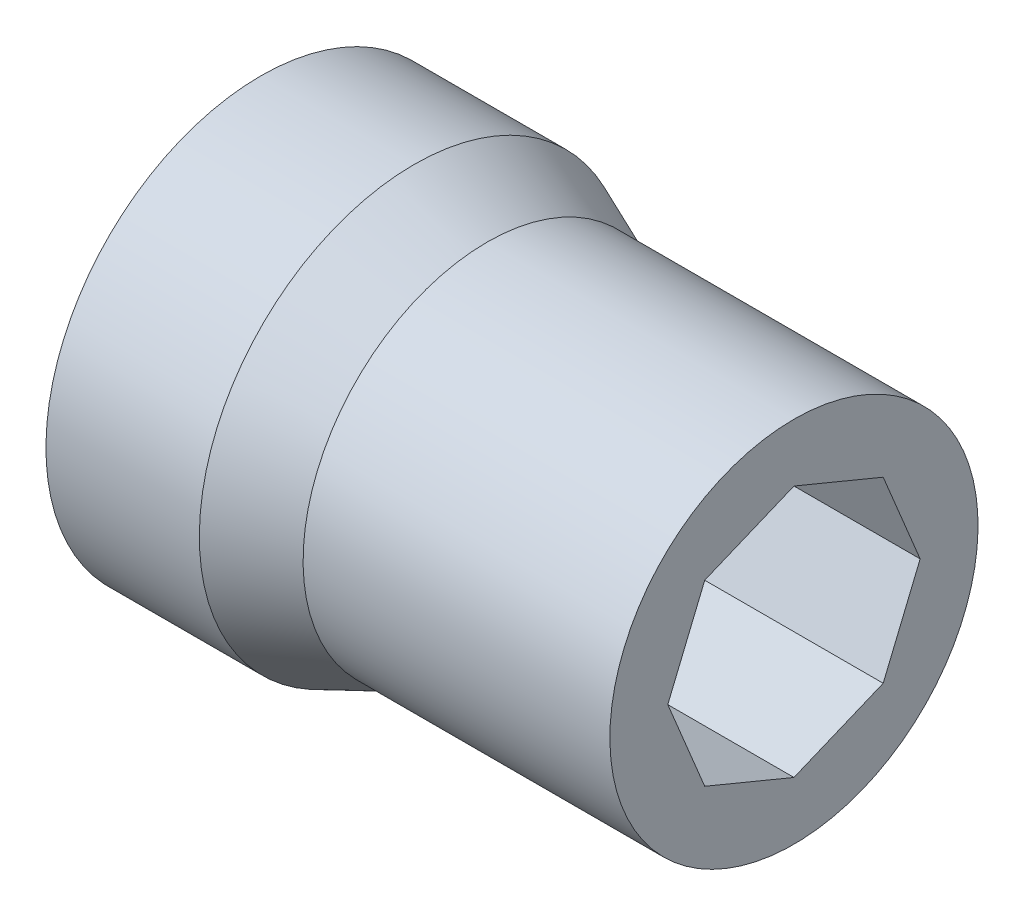
ISO-10303-21;
HEADER;
FILE_DESCRIPTION(('STEP AP214'),'2;1');
FILE_NAME('part.step','',(''),(''),'','','');
FILE_SCHEMA(('AUTOMOTIVE_DESIGN { 1 0 10303 214 1 1 1 1 }'));
ENDSEC;
DATA;
#1=APPLICATION_CONTEXT('core data for automotive mechanical design processes');
#2=APPLICATION_PROTOCOL_DEFINITION('international standard','automotive_design',2000,#1);
#3=PRODUCT_CONTEXT('',#1,'mechanical');
#4=PRODUCT('Part','Part','',(#3));
#5=PRODUCT_RELATED_PRODUCT_CATEGORY('part','',(#4));
#6=PRODUCT_DEFINITION_FORMATION('','',#4);
#7=PRODUCT_DEFINITION_CONTEXT('part definition',#1,'design');
#8=PRODUCT_DEFINITION('design','',#6,#7);
#9=PRODUCT_DEFINITION_SHAPE('','',#8);
#10=(LENGTH_UNIT() NAMED_UNIT(*) SI_UNIT(.MILLI.,.METRE.));
#11=(NAMED_UNIT(*) PLANE_ANGLE_UNIT() SI_UNIT($,.RADIAN.));
#12=(NAMED_UNIT(*) SI_UNIT($,.STERADIAN.) SOLID_ANGLE_UNIT());
#13=UNCERTAINTY_MEASURE_WITH_UNIT(LENGTH_MEASURE(1.E-05),#10,'distance_accuracy_value','');
#14=(GEOMETRIC_REPRESENTATION_CONTEXT(3) GLOBAL_UNCERTAINTY_ASSIGNED_CONTEXT((#13)) GLOBAL_UNIT_ASSIGNED_CONTEXT((#10,
#11,#12)) REPRESENTATION_CONTEXT('',''));
#15=CARTESIAN_POINT('',(0.,0.,0.));
#16=DIRECTION('',(0.,0.,1.));
#17=DIRECTION('',(1.,0.,0.));
#18=AXIS2_PLACEMENT_3D('',#15,#16,#17);
#19=CARTESIAN_POINT('',(3.6905989232415,0.,0.));
#20=DIRECTION('',(-1.,0.,0.));
#21=DIRECTION('',(0.,-1.,0.));
#22=AXIS2_PLACEMENT_3D('',#19,#20,#21);
#23=PLANE('',#22);
#24=DIRECTION('',(0.,-0.923879532511285,-0.382683432365095));
#25=VECTOR('',#24,1.);
#26=CARTESIAN_POINT('',(3.6905989232415,0.,2.05654518055555));
#27=LINE('',#26,#25);
#28=CARTESIAN_POINT('',(3.6905989232415,0.,2.05654518055555));
#29=VERTEX_POINT('',#28);
#30=CARTESIAN_POINT('',(3.6905989232415,-1.45419704298735,1.45419704298733));
#31=VERTEX_POINT('',#30);
#32=EDGE_CURVE('E152',#29,#31,#27,.T.);
#33=ORIENTED_EDGE('',*,*,#32,.F.);
#34=DIRECTION('',(0.,-0.923879532511289,0.382683432365085));
#35=VECTOR('',#34,1.);
#36=CARTESIAN_POINT('',(3.6905989232415,1.45419704298733,1.45419704298735));
#37=LINE('',#36,#35);
#38=CARTESIAN_POINT('',(3.6905989232415,1.45419704298733,1.45419704298735));
#39=VERTEX_POINT('',#38);
#40=EDGE_CURVE('E60',#39,#29,#37,.T.);
#41=ORIENTED_EDGE('',*,*,#40,.F.);
#42=DIRECTION('',(0.,-0.382683432365095,0.923879532511285));
#43=VECTOR('',#42,1.);
#44=CARTESIAN_POINT('',(3.6905989232415,2.05654518055555,0.));
#45=LINE('',#44,#43);
#46=CARTESIAN_POINT('',(3.6905989232415,2.05654518055555,0.));
#47=VERTEX_POINT('',#46);
#48=EDGE_CURVE('E173',#47,#39,#45,.T.);
#49=ORIENTED_EDGE('',*,*,#48,.F.);
#50=DIRECTION('',(0.,0.382683432365085,0.923879532511289));
#51=VECTOR('',#50,1.);
#52=CARTESIAN_POINT('',(3.6905989232415,1.45419704298735,-1.45419704298733));
#53=LINE('',#52,#51);
#54=CARTESIAN_POINT('',(3.6905989232415,1.45419704298735,-1.45419704298733));
#55=VERTEX_POINT('',#54);
#56=EDGE_CURVE('E170',#55,#47,#53,.T.);
#57=ORIENTED_EDGE('',*,*,#56,.F.);
#58=DIRECTION('',(0.,0.923879532511285,0.382683432365095));
#59=VECTOR('',#58,1.);
#60=CARTESIAN_POINT('',(3.6905989232415,0.,-2.05654518055555));
#61=LINE('',#60,#59);
#62=CARTESIAN_POINT('',(3.6905989232415,0.,-2.05654518055555));
#63=VERTEX_POINT('',#62);
#64=EDGE_CURVE('E120',#63,#55,#61,.T.);
#65=ORIENTED_EDGE('',*,*,#64,.F.);
#66=DIRECTION('',(0.,0.923879532511289,-0.382683432365085));
#67=VECTOR('',#66,1.);
#68=CARTESIAN_POINT('',(3.6905989232415,-1.45419704298733,-1.45419704298735));
#69=LINE('',#68,#67);
#70=CARTESIAN_POINT('',(3.6905989232415,-1.45419704298733,-1.45419704298735));
#71=VERTEX_POINT('',#70);
#72=EDGE_CURVE('E164',#71,#63,#69,.T.);
#73=ORIENTED_EDGE('',*,*,#72,.F.);
#74=DIRECTION('',(0.,0.382683432365095,-0.923879532511285));
#75=VECTOR('',#74,1.);
#76=CARTESIAN_POINT('',(3.6905989232415,-2.05654518055555,0.));
#77=LINE('',#76,#75);
#78=CARTESIAN_POINT('',(3.6905989232415,-2.05654518055555,0.));
#79=VERTEX_POINT('',#78);
#80=EDGE_CURVE('E160',#79,#71,#77,.T.);
#81=ORIENTED_EDGE('',*,*,#80,.F.);
#82=DIRECTION('',(0.,-0.382683432365085,-0.923879532511289));
#83=VECTOR('',#82,1.);
#84=CARTESIAN_POINT('',(3.6905989232415,-1.45419704298735,1.45419704298733));
#85=LINE('',#84,#83);
#86=EDGE_CURVE('E156',#31,#79,#85,.T.);
#87=ORIENTED_EDGE('',*,*,#86,.F.);
#88=EDGE_LOOP('',(#33,#41,#49,#57,#65,#73,#81,#87));
#89=FACE_BOUND('',#88,.T.);
#90=CARTESIAN_POINT('',(3.6905989232415,0.,0.));
#91=DIRECTION('',(1.,0.,0.));
#92=DIRECTION('',(0.,1.,0.));
#93=AXIS2_PLACEMENT_3D('',#90,#91,#92);
#94=CIRCLE('',#93,3.);
#95=CARTESIAN_POINT('',(3.6905989232415,3.,0.));
#96=VERTEX_POINT('',#95);
#97=EDGE_CURVE('E11',#96,#96,#94,.T.);
#98=ORIENTED_EDGE('',*,*,#97,.T.);
#99=EDGE_LOOP('',(#98));
#100=FACE_BOUND('',#99,.T.);
#101=ADVANCED_FACE('F45',(#89,#100),#23,.F.);
#102=CARTESIAN_POINT('',(0.,0.,0.));
#103=DIRECTION('',(1.,0.,0.));
#104=DIRECTION('',(0.,1.,0.));
#105=AXIS2_PLACEMENT_3D('',#102,#103,#104);
#106=CYLINDRICAL_SURFACE('',#105,3.);
#107=ORIENTED_EDGE('',*,*,#97,.F.);
#108=EDGE_LOOP('',(#107));
#109=FACE_BOUND('',#108,.T.);
#110=CARTESIAN_POINT('',(-1.3094010767585,0.,0.));
#111=DIRECTION('',(1.,0.,0.));
#112=DIRECTION('',(0.,1.,0.));
#113=AXIS2_PLACEMENT_3D('',#110,#111,#112);
#114=CIRCLE('',#113,3.);
#115=CARTESIAN_POINT('',(-1.3094010767585,3.,0.));
#116=VERTEX_POINT('',#115);
#117=EDGE_CURVE('E53',#116,#116,#114,.T.);
#118=ORIENTED_EDGE('',*,*,#117,.T.);
#119=EDGE_LOOP('',(#118));
#120=FACE_BOUND('',#119,.T.);
#121=ADVANCED_FACE('F205',(#109,#120),#106,.T.);
#122=CARTESIAN_POINT('',(-1.3094010767585,0.,0.));
#123=DIRECTION('',(-1.,0.,0.));
#124=DIRECTION('',(0.,-1.,0.));
#125=AXIS2_PLACEMENT_3D('',#122,#123,#124);
#126=CONICAL_SURFACE('',#125,3.,0.397591187437425);
#127=CARTESIAN_POINT('',(-2.5,0.,0.));
#128=DIRECTION('',(1.,0.,0.));
#129=DIRECTION('',(0.,1.,0.));
#130=AXIS2_PLACEMENT_3D('',#127,#128,#129);
#131=CIRCLE('',#130,3.5);
#132=CARTESIAN_POINT('',(-2.5,3.5,0.));
#133=VERTEX_POINT('',#132);
#134=EDGE_CURVE('E198',#133,#133,#131,.T.);
#135=ORIENTED_EDGE('',*,*,#134,.T.);
#136=EDGE_LOOP('',(#135));
#137=FACE_BOUND('',#136,.T.);
#138=ORIENTED_EDGE('',*,*,#117,.F.);
#139=EDGE_LOOP('',(#138));
#140=FACE_BOUND('',#139,.T.);
#141=ADVANCED_FACE('F207',(#137,#140),#126,.T.);
#142=CARTESIAN_POINT('',(0.,0.,0.));
#143=DIRECTION('',(1.,0.,0.));
#144=DIRECTION('',(0.,1.,0.));
#145=AXIS2_PLACEMENT_3D('',#142,#143,#144);
#146=CYLINDRICAL_SURFACE('',#145,3.5);
#147=ORIENTED_EDGE('',*,*,#134,.F.);
#148=EDGE_LOOP('',(#147));
#149=FACE_BOUND('',#148,.T.);
#150=CARTESIAN_POINT('',(-5.,0.,0.));
#151=DIRECTION('',(1.,0.,0.));
#152=DIRECTION('',(0.,1.,0.));
#153=AXIS2_PLACEMENT_3D('',#150,#151,#152);
#154=CIRCLE('',#153,3.5);
#155=CARTESIAN_POINT('',(-5.,3.5,0.));
#156=VERTEX_POINT('',#155);
#157=EDGE_CURVE('E179',#156,#156,#154,.T.);
#158=ORIENTED_EDGE('',*,*,#157,.T.);
#159=EDGE_LOOP('',(#158));
#160=FACE_BOUND('',#159,.T.);
#161=ADVANCED_FACE('F209',(#149,#160),#146,.T.);
#162=CARTESIAN_POINT('',(-5.,0.,0.));
#163=DIRECTION('',(1.,0.,0.));
#164=DIRECTION('',(0.,1.,0.));
#165=AXIS2_PLACEMENT_3D('',#162,#163,#164);
#166=PLANE('',#165);
#167=ORIENTED_EDGE('',*,*,#157,.F.);
#168=EDGE_LOOP('',(#167));
#169=FACE_BOUND('',#168,.T.);
#170=ADVANCED_FACE('F216',(#169),#166,.F.);
#171=CARTESIAN_POINT('',(-0.309401076758498,1.45419704298733,1.45419704298735));
#172=DIRECTION('',(0.,0.382683432365085,0.923879532511289));
#173=DIRECTION('',(0.,-0.923879532511289,0.382683432365085));
#174=AXIS2_PLACEMENT_3D('',#171,#172,#173);
#175=PLANE('',#174);
#176=ORIENTED_EDGE('',*,*,#40,.T.);
#177=DIRECTION('',(1.,0.,0.));
#178=VECTOR('',#177,1.);
#179=CARTESIAN_POINT('',(-0.309401076758498,0.,2.05654518055555));
#180=LINE('',#179,#178);
#181=CARTESIAN_POINT('',(-0.309401076758498,0.,2.05654518055555));
#182=VERTEX_POINT('',#181);
#183=EDGE_CURVE('E96',#182,#29,#180,.T.);
#184=ORIENTED_EDGE('',*,*,#183,.F.);
#185=DIRECTION('',(0.,-0.923879532511289,0.382683432365085));
#186=VECTOR('',#185,1.);
#187=CARTESIAN_POINT('',(-0.309401076758498,1.45419704298733,1.45419704298735));
#188=LINE('',#187,#186);
#189=CARTESIAN_POINT('',(-0.309401076758498,1.45419704298733,1.45419704298735));
#190=VERTEX_POINT('',#189);
#191=EDGE_CURVE('E176',#190,#182,#188,.T.);
#192=ORIENTED_EDGE('',*,*,#191,.F.);
#193=DIRECTION('',(1.,0.,0.));
#194=VECTOR('',#193,1.);
#195=CARTESIAN_POINT('',(-0.309401076758498,1.45419704298733,1.45419704298735));
#196=LINE('',#195,#194);
#197=EDGE_CURVE('E68',#190,#39,#196,.T.);
#198=ORIENTED_EDGE('',*,*,#197,.T.);
#199=EDGE_LOOP('',(#176,#184,#192,#198));
#200=FACE_BOUND('',#199,.T.);
#201=ADVANCED_FACE('F254',(#200),#175,.F.);
#202=CARTESIAN_POINT('',(-0.309401076758498,2.05654518055555,0.));
#203=DIRECTION('',(0.,0.923879532511285,0.382683432365095));
#204=DIRECTION('',(0.,-0.382683432365095,0.923879532511285));
#205=AXIS2_PLACEMENT_3D('',#202,#203,#204);
#206=PLANE('',#205);
#207=ORIENTED_EDGE('',*,*,#48,.T.);
#208=ORIENTED_EDGE('',*,*,#197,.F.);
#209=DIRECTION('',(0.,-0.382683432365095,0.923879532511285));
#210=VECTOR('',#209,1.);
#211=CARTESIAN_POINT('',(-0.309401076758498,2.05654518055555,0.));
#212=LINE('',#211,#210);
#213=CARTESIAN_POINT('',(-0.309401076758498,2.05654518055555,0.));
#214=VERTEX_POINT('',#213);
#215=EDGE_CURVE('E134',#214,#190,#212,.T.);
#216=ORIENTED_EDGE('',*,*,#215,.F.);
#217=DIRECTION('',(1.,0.,0.));
#218=VECTOR('',#217,1.);
#219=CARTESIAN_POINT('',(-0.309401076758498,2.05654518055555,0.));
#220=LINE('',#219,#218);
#221=EDGE_CURVE('E125',#214,#47,#220,.T.);
#222=ORIENTED_EDGE('',*,*,#221,.T.);
#223=EDGE_LOOP('',(#207,#208,#216,#222));
#224=FACE_BOUND('',#223,.T.);
#225=ADVANCED_FACE('F252',(#224),#206,.F.);
#226=CARTESIAN_POINT('',(-0.309401076758498,1.45419704298735,-1.45419704298733));
#227=DIRECTION('',(0.,0.923879532511289,-0.382683432365085));
#228=DIRECTION('',(0.,0.382683432365085,0.923879532511289));
#229=AXIS2_PLACEMENT_3D('',#226,#227,#228);
#230=PLANE('',#229);
#231=ORIENTED_EDGE('',*,*,#56,.T.);
#232=ORIENTED_EDGE('',*,*,#221,.F.);
#233=DIRECTION('',(0.,0.382683432365085,0.923879532511289));
#234=VECTOR('',#233,1.);
#235=CARTESIAN_POINT('',(-0.309401076758498,1.45419704298735,-1.45419704298733));
#236=LINE('',#235,#234);
#237=CARTESIAN_POINT('',(-0.309401076758498,1.45419704298735,-1.45419704298733));
#238=VERTEX_POINT('',#237);
#239=EDGE_CURVE('E129',#238,#214,#236,.T.);
#240=ORIENTED_EDGE('',*,*,#239,.F.);
#241=DIRECTION('',(1.,0.,0.));
#242=VECTOR('',#241,1.);
#243=CARTESIAN_POINT('',(-0.309401076758498,1.45419704298735,-1.45419704298733));
#244=LINE('',#243,#242);
#245=EDGE_CURVE('E113',#238,#55,#244,.T.);
#246=ORIENTED_EDGE('',*,*,#245,.T.);
#247=EDGE_LOOP('',(#231,#232,#240,#246));
#248=FACE_BOUND('',#247,.T.);
#249=ADVANCED_FACE('F130',(#248),#230,.F.);
#250=CARTESIAN_POINT('',(-0.309401076758498,0.,-2.05654518055555));
#251=DIRECTION('',(0.,0.382683432365095,-0.923879532511285));
#252=DIRECTION('',(0.,0.923879532511285,0.382683432365095));
#253=AXIS2_PLACEMENT_3D('',#250,#251,#252);
#254=PLANE('',#253);
#255=ORIENTED_EDGE('',*,*,#64,.T.);
#256=ORIENTED_EDGE('',*,*,#245,.F.);
#257=DIRECTION('',(0.,0.923879532511285,0.382683432365095));
#258=VECTOR('',#257,1.);
#259=CARTESIAN_POINT('',(-0.309401076758498,0.,-2.05654518055555));
#260=LINE('',#259,#258);
#261=CARTESIAN_POINT('',(-0.309401076758498,0.,-2.05654518055555));
#262=VERTEX_POINT('',#261);
#263=EDGE_CURVE('E117',#262,#238,#260,.T.);
#264=ORIENTED_EDGE('',*,*,#263,.F.);
#265=DIRECTION('',(1.,0.,0.));
#266=VECTOR('',#265,1.);
#267=CARTESIAN_POINT('',(-0.309401076758498,0.,-2.05654518055555));
#268=LINE('',#267,#266);
#269=EDGE_CURVE('E126',#262,#63,#268,.T.);
#270=ORIENTED_EDGE('',*,*,#269,.T.);
#271=EDGE_LOOP('',(#255,#256,#264,#270));
#272=FACE_BOUND('',#271,.T.);
#273=ADVANCED_FACE('F115',(#272),#254,.F.);
#274=CARTESIAN_POINT('',(-0.309401076758498,-1.45419704298733,-1.45419704298735));
#275=DIRECTION('',(0.,-0.382683432365085,-0.923879532511289));
#276=DIRECTION('',(0.,0.923879532511289,-0.382683432365085));
#277=AXIS2_PLACEMENT_3D('',#274,#275,#276);
#278=PLANE('',#277);
#279=ORIENTED_EDGE('',*,*,#72,.T.);
#280=ORIENTED_EDGE('',*,*,#269,.F.);
#281=DIRECTION('',(0.,0.923879532511289,-0.382683432365085));
#282=VECTOR('',#281,1.);
#283=CARTESIAN_POINT('',(-0.309401076758498,-1.45419704298733,-1.45419704298735));
#284=LINE('',#283,#282);
#285=CARTESIAN_POINT('',(-0.309401076758498,-1.45419704298733,-1.45419704298735));
#286=VERTEX_POINT('',#285);
#287=EDGE_CURVE('E140',#286,#262,#284,.T.);
#288=ORIENTED_EDGE('',*,*,#287,.F.);
#289=DIRECTION('',(1.,0.,0.));
#290=VECTOR('',#289,1.);
#291=CARTESIAN_POINT('',(-0.309401076758498,-1.45419704298733,-1.45419704298735));
#292=LINE('',#291,#290);
#293=EDGE_CURVE('E184',#286,#71,#292,.T.);
#294=ORIENTED_EDGE('',*,*,#293,.T.);
#295=EDGE_LOOP('',(#279,#280,#288,#294));
#296=FACE_BOUND('',#295,.T.);
#297=ADVANCED_FACE('F251',(#296),#278,.F.);
#298=CARTESIAN_POINT('',(-0.309401076758497,-2.05654518055555,0.));
#299=DIRECTION('',(0.,-0.923879532511285,-0.382683432365095));
#300=DIRECTION('',(0.,0.382683432365095,-0.923879532511285));
#301=AXIS2_PLACEMENT_3D('',#298,#299,#300);
#302=PLANE('',#301);
#303=ORIENTED_EDGE('',*,*,#80,.T.);
#304=ORIENTED_EDGE('',*,*,#293,.F.);
#305=DIRECTION('',(0.,0.382683432365095,-0.923879532511285));
#306=VECTOR('',#305,1.);
#307=CARTESIAN_POINT('',(-0.309401076758497,-2.05654518055555,0.));
#308=LINE('',#307,#306);
#309=CARTESIAN_POINT('',(-0.309401076758497,-2.05654518055555,0.));
#310=VERTEX_POINT('',#309);
#311=EDGE_CURVE('E144',#310,#286,#308,.T.);
#312=ORIENTED_EDGE('',*,*,#311,.F.);
#313=DIRECTION('',(1.,0.,0.));
#314=VECTOR('',#313,1.);
#315=CARTESIAN_POINT('',(-0.309401076758497,-2.05654518055555,0.));
#316=LINE('',#315,#314);
#317=EDGE_CURVE('E187',#310,#79,#316,.T.);
#318=ORIENTED_EDGE('',*,*,#317,.T.);
#319=EDGE_LOOP('',(#303,#304,#312,#318));
#320=FACE_BOUND('',#319,.T.);
#321=ADVANCED_FACE('F248',(#320),#302,.F.);
#322=CARTESIAN_POINT('',(-0.309401076758498,-1.45419704298735,1.45419704298733));
#323=DIRECTION('',(0.,-0.923879532511289,0.382683432365085));
#324=DIRECTION('',(0.,-0.382683432365085,-0.923879532511289));
#325=AXIS2_PLACEMENT_3D('',#322,#323,#324);
#326=PLANE('',#325);
#327=ORIENTED_EDGE('',*,*,#86,.T.);
#328=ORIENTED_EDGE('',*,*,#317,.F.);
#329=DIRECTION('',(0.,-0.382683432365085,-0.923879532511289));
#330=VECTOR('',#329,1.);
#331=CARTESIAN_POINT('',(-0.309401076758498,-1.45419704298735,1.45419704298733));
#332=LINE('',#331,#330);
#333=CARTESIAN_POINT('',(-0.309401076758498,-1.45419704298735,1.45419704298733));
#334=VERTEX_POINT('',#333);
#335=EDGE_CURVE('E239',#334,#310,#332,.T.);
#336=ORIENTED_EDGE('',*,*,#335,.F.);
#337=DIRECTION('',(1.,0.,0.));
#338=VECTOR('',#337,1.);
#339=CARTESIAN_POINT('',(-0.309401076758498,-1.45419704298735,1.45419704298733));
#340=LINE('',#339,#338);
#341=EDGE_CURVE('E190',#334,#31,#340,.T.);
#342=ORIENTED_EDGE('',*,*,#341,.T.);
#343=EDGE_LOOP('',(#327,#328,#336,#342));
#344=FACE_BOUND('',#343,.T.);
#345=ADVANCED_FACE('F269',(#344),#326,.F.);
#346=CARTESIAN_POINT('',(-0.309401076758498,0.,2.05654518055555));
#347=DIRECTION('',(0.,-0.382683432365095,0.923879532511285));
#348=DIRECTION('',(0.,-0.923879532511285,-0.382683432365095));
#349=AXIS2_PLACEMENT_3D('',#346,#347,#348);
#350=PLANE('',#349);
#351=ORIENTED_EDGE('',*,*,#32,.T.);
#352=ORIENTED_EDGE('',*,*,#341,.F.);
#353=DIRECTION('',(0.,-0.923879532511285,-0.382683432365095));
#354=VECTOR('',#353,1.);
#355=CARTESIAN_POINT('',(-0.309401076758498,0.,2.05654518055555));
#356=LINE('',#355,#354);
#357=EDGE_CURVE('E236',#182,#334,#356,.T.);
#358=ORIENTED_EDGE('',*,*,#357,.F.);
#359=ORIENTED_EDGE('',*,*,#183,.T.);
#360=EDGE_LOOP('',(#351,#352,#358,#359));
#361=FACE_BOUND('',#360,.T.);
#362=ADVANCED_FACE('F233',(#361),#350,.F.);
#363=CARTESIAN_POINT('',(-0.309401076758498,0.,0.));
#364=DIRECTION('',(1.,0.,0.));
#365=DIRECTION('',(0.,0.,-1.));
#366=AXIS2_PLACEMENT_3D('',#363,#364,#365);
#367=PLANE('',#366);
#368=ORIENTED_EDGE('',*,*,#191,.T.);
#369=ORIENTED_EDGE('',*,*,#357,.T.);
#370=ORIENTED_EDGE('',*,*,#335,.T.);
#371=ORIENTED_EDGE('',*,*,#311,.T.);
#372=ORIENTED_EDGE('',*,*,#287,.T.);
#373=ORIENTED_EDGE('',*,*,#263,.T.);
#374=ORIENTED_EDGE('',*,*,#239,.T.);
#375=ORIENTED_EDGE('',*,*,#215,.T.);
#376=EDGE_LOOP('',(#368,#369,#370,#371,#372,#373,#374,#375));
#377=FACE_BOUND('',#376,.T.);
#378=ADVANCED_FACE('F137',(#377),#367,.T.);
#379=CLOSED_SHELL('',(#101,#121,#141,#161,#170,#201,#225,#249,#273,#297,#321,#345,#362,#378));
#380=MANIFOLD_SOLID_BREP('B2',#379);
#381=ADVANCED_BREP_SHAPE_REPRESENTATION('',(#18,#380),#14);
#382=SHAPE_DEFINITION_REPRESENTATION(#9,#381);
ENDSEC;
END-ISO-10303-21;
